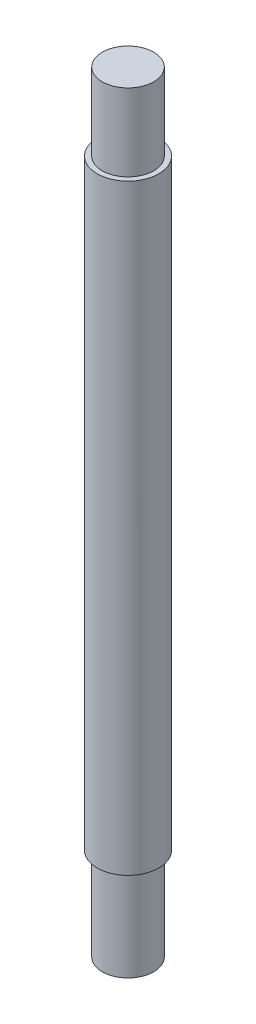
ISO-10303-21;
HEADER;
FILE_DESCRIPTION(('STEP AP214'),'2;1');
FILE_NAME('part.step','',(''),(''),'','','');
FILE_SCHEMA(('AUTOMOTIVE_DESIGN { 1 0 10303 214 1 1 1 1 }'));
ENDSEC;
DATA;
#1=APPLICATION_CONTEXT('core data for automotive mechanical design processes');
#2=APPLICATION_PROTOCOL_DEFINITION('international standard','automotive_design',2000,#1);
#3=PRODUCT_CONTEXT('',#1,'mechanical');
#4=PRODUCT('Part','Part','',(#3));
#5=PRODUCT_RELATED_PRODUCT_CATEGORY('part','',(#4));
#6=PRODUCT_DEFINITION_FORMATION('','',#4);
#7=PRODUCT_DEFINITION_CONTEXT('part definition',#1,'design');
#8=PRODUCT_DEFINITION('design','',#6,#7);
#9=PRODUCT_DEFINITION_SHAPE('','',#8);
#10=(LENGTH_UNIT() NAMED_UNIT(*) SI_UNIT(.MILLI.,.METRE.));
#11=(NAMED_UNIT(*) PLANE_ANGLE_UNIT() SI_UNIT($,.RADIAN.));
#12=(NAMED_UNIT(*) SI_UNIT($,.STERADIAN.) SOLID_ANGLE_UNIT());
#13=UNCERTAINTY_MEASURE_WITH_UNIT(LENGTH_MEASURE(1.E-05),#10,'distance_accuracy_value','');
#14=(GEOMETRIC_REPRESENTATION_CONTEXT(3) GLOBAL_UNCERTAINTY_ASSIGNED_CONTEXT((#13)) GLOBAL_UNIT_ASSIGNED_CONTEXT((#10,
#11,#12)) REPRESENTATION_CONTEXT('',''));
#15=CARTESIAN_POINT('',(0.,0.,0.));
#16=DIRECTION('',(0.,0.,1.));
#17=DIRECTION('',(1.,0.,0.));
#18=AXIS2_PLACEMENT_3D('',#15,#16,#17);
#19=CARTESIAN_POINT('',(0.,150.,0.));
#20=DIRECTION('',(0.,-1.,0.));
#21=DIRECTION('',(0.,0.,-1.));
#22=AXIS2_PLACEMENT_3D('',#19,#20,#21);
#23=CYLINDRICAL_SURFACE('',#22,6.);
#24=CARTESIAN_POINT('',(0.,135.,0.));
#25=DIRECTION('',(0.,1.,0.));
#26=DIRECTION('',(0.,0.,1.));
#27=AXIS2_PLACEMENT_3D('',#24,#25,#26);
#28=CIRCLE('',#27,6.);
#29=CARTESIAN_POINT('',(0.,135.,6.));
#30=VERTEX_POINT('',#29);
#31=EDGE_CURVE('E10',#30,#30,#28,.T.);
#32=ORIENTED_EDGE('',*,*,#31,.F.);
#33=EDGE_LOOP('',(#32));
#34=FACE_BOUND('',#33,.T.);
#35=CARTESIAN_POINT('',(0.,18.,0.));
#36=DIRECTION('',(0.,-1.,0.));
#37=DIRECTION('',(0.,0.,-1.));
#38=AXIS2_PLACEMENT_3D('',#35,#36,#37);
#39=CIRCLE('',#38,6.);
#40=CARTESIAN_POINT('',(0.,18.,-6.));
#41=VERTEX_POINT('',#40);
#42=EDGE_CURVE('E52',#41,#41,#39,.T.);
#43=ORIENTED_EDGE('',*,*,#42,.F.);
#44=EDGE_LOOP('',(#43));
#45=FACE_BOUND('',#44,.T.);
#46=ADVANCED_FACE('F37',(#34,#45),#23,.T.);
#47=CARTESIAN_POINT('',(0.,135.,0.));
#48=DIRECTION('',(0.,1.,0.));
#49=DIRECTION('',(0.,0.,1.));
#50=AXIS2_PLACEMENT_3D('',#47,#48,#49);
#51=PLANE('',#50);
#52=CARTESIAN_POINT('',(0.,135.,0.));
#53=DIRECTION('',(0.,1.,0.));
#54=DIRECTION('',(0.,0.,1.));
#55=AXIS2_PLACEMENT_3D('',#52,#53,#54);
#56=CIRCLE('',#55,5.);
#57=CARTESIAN_POINT('',(0.,135.,5.));
#58=VERTEX_POINT('',#57);
#59=EDGE_CURVE('E43',#58,#58,#56,.T.);
#60=ORIENTED_EDGE('',*,*,#59,.F.);
#61=EDGE_LOOP('',(#60));
#62=FACE_BOUND('',#61,.T.);
#63=ORIENTED_EDGE('',*,*,#31,.T.);
#64=EDGE_LOOP('',(#63));
#65=FACE_BOUND('',#64,.T.);
#66=ADVANCED_FACE('F74',(#62,#65),#51,.T.);
#67=CARTESIAN_POINT('',(0.,135.,0.));
#68=DIRECTION('',(0.,1.,0.));
#69=DIRECTION('',(0.,0.,1.));
#70=AXIS2_PLACEMENT_3D('',#67,#68,#69);
#71=CYLINDRICAL_SURFACE('',#70,5.);
#72=ORIENTED_EDGE('',*,*,#59,.T.);
#73=EDGE_LOOP('',(#72));
#74=FACE_BOUND('',#73,.T.);
#75=CARTESIAN_POINT('',(0.,150.,0.));
#76=DIRECTION('',(0.,1.,0.));
#77=DIRECTION('',(0.,0.,1.));
#78=AXIS2_PLACEMENT_3D('',#75,#76,#77);
#79=CIRCLE('',#78,5.);
#80=CARTESIAN_POINT('',(0.,150.,5.));
#81=VERTEX_POINT('',#80);
#82=EDGE_CURVE('E47',#81,#81,#79,.T.);
#83=ORIENTED_EDGE('',*,*,#82,.F.);
#84=EDGE_LOOP('',(#83));
#85=FACE_BOUND('',#84,.T.);
#86=ADVANCED_FACE('F80',(#74,#85),#71,.T.);
#87=CARTESIAN_POINT('',(0.,150.,0.));
#88=DIRECTION('',(0.,1.,0.));
#89=DIRECTION('',(0.,0.,1.));
#90=AXIS2_PLACEMENT_3D('',#87,#88,#89);
#91=PLANE('',#90);
#92=ORIENTED_EDGE('',*,*,#82,.T.);
#93=EDGE_LOOP('',(#92));
#94=FACE_BOUND('',#93,.T.);
#95=ADVANCED_FACE('F69',(#94),#91,.T.);
#96=CARTESIAN_POINT('',(0.,18.,0.));
#97=DIRECTION('',(0.,-1.,0.));
#98=DIRECTION('',(0.,0.,-1.));
#99=AXIS2_PLACEMENT_3D('',#96,#97,#98);
#100=PLANE('',#99);
#101=CARTESIAN_POINT('',(0.,18.,0.));
#102=DIRECTION('',(0.,-1.,0.));
#103=DIRECTION('',(0.,0.,-1.));
#104=AXIS2_PLACEMENT_3D('',#101,#102,#103);
#105=CIRCLE('',#104,5.);
#106=CARTESIAN_POINT('',(0.,18.,-5.));
#107=VERTEX_POINT('',#106);
#108=EDGE_CURVE('E56',#107,#107,#105,.T.);
#109=ORIENTED_EDGE('',*,*,#108,.F.);
#110=EDGE_LOOP('',(#109));
#111=FACE_BOUND('',#110,.T.);
#112=ORIENTED_EDGE('',*,*,#42,.T.);
#113=EDGE_LOOP('',(#112));
#114=FACE_BOUND('',#113,.T.);
#115=ADVANCED_FACE('F66',(#111,#114),#100,.T.);
#116=CARTESIAN_POINT('',(0.,18.,0.));
#117=DIRECTION('',(0.,-1.,0.));
#118=DIRECTION('',(0.,0.,-1.));
#119=AXIS2_PLACEMENT_3D('',#116,#117,#118);
#120=CYLINDRICAL_SURFACE('',#119,5.);
#121=ORIENTED_EDGE('',*,*,#108,.T.);
#122=EDGE_LOOP('',(#121));
#123=FACE_BOUND('',#122,.T.);
#124=CARTESIAN_POINT('',(0.,0.,0.));
#125=DIRECTION('',(0.,-1.,0.));
#126=DIRECTION('',(0.,0.,-1.));
#127=AXIS2_PLACEMENT_3D('',#124,#125,#126);
#128=CIRCLE('',#127,5.);
#129=CARTESIAN_POINT('',(0.,0.,-5.));
#130=VERTEX_POINT('',#129);
#131=EDGE_CURVE('E57',#130,#130,#128,.T.);
#132=ORIENTED_EDGE('',*,*,#131,.F.);
#133=EDGE_LOOP('',(#132));
#134=FACE_BOUND('',#133,.T.);
#135=ADVANCED_FACE('F63',(#123,#134),#120,.T.);
#136=CARTESIAN_POINT('',(0.,0.,0.));
#137=DIRECTION('',(0.,1.,0.));
#138=DIRECTION('',(0.,0.,1.));
#139=AXIS2_PLACEMENT_3D('',#136,#137,#138);
#140=PLANE('',#139);
#141=ORIENTED_EDGE('',*,*,#131,.T.);
#142=EDGE_LOOP('',(#141));
#143=FACE_BOUND('',#142,.T.);
#144=ADVANCED_FACE('F89',(#143),#140,.F.);
#145=CLOSED_SHELL('',(#46,#66,#86,#95,#115,#135,#144));
#146=MANIFOLD_SOLID_BREP('B2',#145);
#147=ADVANCED_BREP_SHAPE_REPRESENTATION('',(#18,#146),#14);
#148=SHAPE_DEFINITION_REPRESENTATION(#9,#147);
ENDSEC;
END-ISO-10303-21;
